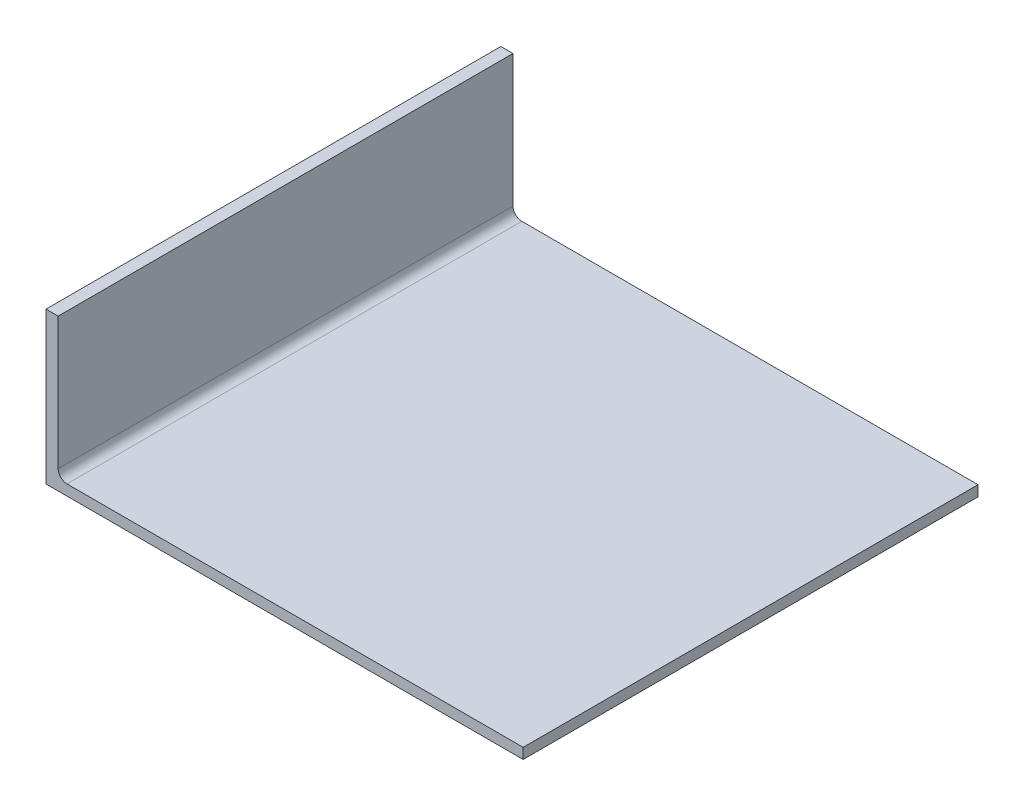
ISO-10303-21;
HEADER;
FILE_DESCRIPTION(('STEP AP214'),'2;1');
FILE_NAME('part.step','',(''),(''),'','','');
FILE_SCHEMA(('AUTOMOTIVE_DESIGN { 1 0 10303 214 1 1 1 1 }'));
ENDSEC;
DATA;
#1=APPLICATION_CONTEXT('core data for automotive mechanical design processes');
#2=APPLICATION_PROTOCOL_DEFINITION('international standard','automotive_design',2000,#1);
#3=PRODUCT_CONTEXT('',#1,'mechanical');
#4=PRODUCT('Part','Part','',(#3));
#5=PRODUCT_RELATED_PRODUCT_CATEGORY('part','',(#4));
#6=PRODUCT_DEFINITION_FORMATION('','',#4);
#7=PRODUCT_DEFINITION_CONTEXT('part definition',#1,'design');
#8=PRODUCT_DEFINITION('design','',#6,#7);
#9=PRODUCT_DEFINITION_SHAPE('','',#8);
#10=(LENGTH_UNIT() NAMED_UNIT(*) SI_UNIT(.MILLI.,.METRE.));
#11=(NAMED_UNIT(*) PLANE_ANGLE_UNIT() SI_UNIT($,.RADIAN.));
#12=(NAMED_UNIT(*) SI_UNIT($,.STERADIAN.) SOLID_ANGLE_UNIT());
#13=UNCERTAINTY_MEASURE_WITH_UNIT(LENGTH_MEASURE(1.E-05),#10,'distance_accuracy_value','');
#14=(GEOMETRIC_REPRESENTATION_CONTEXT(3) GLOBAL_UNCERTAINTY_ASSIGNED_CONTEXT((#13)) GLOBAL_UNIT_ASSIGNED_CONTEXT((#10,
#11,#12)) REPRESENTATION_CONTEXT('',''));
#15=CARTESIAN_POINT('',(0.,0.,0.));
#16=DIRECTION('',(0.,0.,1.));
#17=DIRECTION('',(1.,0.,0.));
#18=AXIS2_PLACEMENT_3D('',#15,#16,#17);
#19=CARTESIAN_POINT('',(-250.24028816854,11.,-21.2242669249853));
#20=DIRECTION('',(0.,0.,1.));
#21=DIRECTION('',(1.,0.,0.));
#22=AXIS2_PLACEMENT_3D('',#19,#20,#21);
#23=CYLINDRICAL_SURFACE('',#22,5.);
#24=DIRECTION('',(0.,0.,-1.));
#25=VECTOR('',#24,1.);
#26=CARTESIAN_POINT('',(-255.24028816854,11.,-21.2242669249853));
#27=LINE('',#26,#25);
#28=CARTESIAN_POINT('',(-255.24028816854,11.,236.996907771633));
#29=VERTEX_POINT('',#28);
#30=CARTESIAN_POINT('',(-255.24028816854,11.,-21.2242669249853));
#31=VERTEX_POINT('',#30);
#32=EDGE_CURVE('E143',#29,#31,#27,.T.);
#33=ORIENTED_EDGE('',*,*,#32,.F.);
#34=CARTESIAN_POINT('',(-250.24028816854,11.,236.996907771633));
#35=DIRECTION('',(0.,0.,-1.));
#36=DIRECTION('',(-1.,0.,0.));
#37=AXIS2_PLACEMENT_3D('',#34,#35,#36);
#38=CIRCLE('',#37,5.);
#39=CARTESIAN_POINT('',(-250.24028816854,6.,236.996907771633));
#40=VERTEX_POINT('',#39);
#41=EDGE_CURVE('E40',#29,#40,#38,.F.);
#42=ORIENTED_EDGE('',*,*,#41,.T.);
#43=DIRECTION('',(0.,0.,-1.));
#44=VECTOR('',#43,1.);
#45=CARTESIAN_POINT('',(-250.24028816854,6.,-21.2242669249853));
#46=LINE('',#45,#44);
#47=CARTESIAN_POINT('',(-250.24028816854,6.,-21.2242669249853));
#48=VERTEX_POINT('',#47);
#49=EDGE_CURVE('E146',#48,#40,#46,.F.);
#50=ORIENTED_EDGE('',*,*,#49,.F.);
#51=CARTESIAN_POINT('',(-250.24028816854,11.,-21.2242669249853));
#52=DIRECTION('',(0.,0.,1.));
#53=DIRECTION('',(1.,0.,0.));
#54=AXIS2_PLACEMENT_3D('',#51,#52,#53);
#55=CIRCLE('',#54,5.);
#56=EDGE_CURVE('E11',#48,#31,#55,.F.);
#57=ORIENTED_EDGE('',*,*,#56,.T.);
#58=EDGE_LOOP('',(#33,#42,#50,#57));
#59=FACE_BOUND('',#58,.T.);
#60=ADVANCED_FACE('F33',(#59),#23,.F.);
#61=CARTESIAN_POINT('',(0.,6.,0.));
#62=DIRECTION('',(0.,-1.,0.));
#63=DIRECTION('',(0.,0.,-1.));
#64=AXIS2_PLACEMENT_3D('',#61,#62,#63);
#65=PLANE('',#64);
#66=DIRECTION('',(-1.,0.,0.));
#67=VECTOR('',#66,1.);
#68=CARTESIAN_POINT('',(8.75531028896149,6.,-21.2242669249854));
#69=LINE('',#68,#67);
#70=CARTESIAN_POINT('',(8.75531028896149,6.,-21.2242669249854));
#71=VERTEX_POINT('',#70);
#72=EDGE_CURVE('E125',#71,#48,#69,.T.);
#73=ORIENTED_EDGE('',*,*,#72,.T.);
#74=ORIENTED_EDGE('',*,*,#49,.T.);
#75=DIRECTION('',(1.,0.,0.));
#76=VECTOR('',#75,1.);
#77=CARTESIAN_POINT('',(8.75531028896152,6.,236.996907771633));
#78=LINE('',#77,#76);
#79=CARTESIAN_POINT('',(8.75531028896152,6.,236.996907771633));
#80=VERTEX_POINT('',#79);
#81=EDGE_CURVE('E129',#40,#80,#78,.T.);
#82=ORIENTED_EDGE('',*,*,#81,.T.);
#83=DIRECTION('',(0.,0.,-1.));
#84=VECTOR('',#83,1.);
#85=CARTESIAN_POINT('',(8.75531028896149,6.,-21.2242669249854));
#86=LINE('',#85,#84);
#87=EDGE_CURVE('E122',#80,#71,#86,.T.);
#88=ORIENTED_EDGE('',*,*,#87,.T.);
#89=EDGE_LOOP('',(#73,#74,#82,#88));
#90=FACE_BOUND('',#89,.T.);
#91=ADVANCED_FACE('F149',(#90),#65,.F.);
#92=CARTESIAN_POINT('',(8.75531028896149,6.,-21.2242669249854));
#93=DIRECTION('',(-1.,0.,0.));
#94=DIRECTION('',(0.,0.,1.));
#95=AXIS2_PLACEMENT_3D('',#92,#93,#94);
#96=PLANE('',#95);
#97=DIRECTION('',(0.,0.,-1.));
#98=VECTOR('',#97,1.);
#99=CARTESIAN_POINT('',(8.75531028896149,0.,-21.2242669249854));
#100=LINE('',#99,#98);
#101=CARTESIAN_POINT('',(8.75531028896152,0.,236.996907771633));
#102=VERTEX_POINT('',#101);
#103=CARTESIAN_POINT('',(8.75531028896149,0.,-21.2242669249854));
#104=VERTEX_POINT('',#103);
#105=EDGE_CURVE('E121',#102,#104,#100,.T.);
#106=ORIENTED_EDGE('',*,*,#105,.T.);
#107=DIRECTION('',(0.,-1.,0.));
#108=VECTOR('',#107,1.);
#109=CARTESIAN_POINT('',(8.75531028896149,6.,-21.2242669249854));
#110=LINE('',#109,#108);
#111=EDGE_CURVE('E140',#71,#104,#110,.T.);
#112=ORIENTED_EDGE('',*,*,#111,.F.);
#113=ORIENTED_EDGE('',*,*,#87,.F.);
#114=DIRECTION('',(0.,-1.,0.));
#115=VECTOR('',#114,1.);
#116=CARTESIAN_POINT('',(8.75531028896152,6.,236.996907771633));
#117=LINE('',#116,#115);
#118=EDGE_CURVE('E99',#80,#102,#117,.T.);
#119=ORIENTED_EDGE('',*,*,#118,.T.);
#120=EDGE_LOOP('',(#106,#112,#113,#119));
#121=FACE_BOUND('',#120,.T.);
#122=ADVANCED_FACE('F155',(#121),#96,.F.);
#123=CARTESIAN_POINT('',(8.75531028896149,6.,-21.2242669249854));
#124=DIRECTION('',(0.,0.,1.));
#125=DIRECTION('',(1.,0.,0.));
#126=AXIS2_PLACEMENT_3D('',#123,#124,#125);
#127=PLANE('',#126);
#128=DIRECTION('',(-1.,0.,0.));
#129=VECTOR('',#128,1.);
#130=CARTESIAN_POINT('',(8.75531028896149,0.,-21.2242669249854));
#131=LINE('',#130,#129);
#132=CARTESIAN_POINT('',(-262.132502922839,0.,-21.2242669249853));
#133=VERTEX_POINT('',#132);
#134=EDGE_CURVE('E133',#104,#133,#131,.T.);
#135=ORIENTED_EDGE('',*,*,#134,.T.);
#136=DIRECTION('',(0.,-1.,0.));
#137=VECTOR('',#136,1.);
#138=CARTESIAN_POINT('',(-262.132502922839,6.,-21.2242669249853));
#139=LINE('',#138,#137);
#140=CARTESIAN_POINT('',(-262.132502922839,86.,-21.2242669249853));
#141=VERTEX_POINT('',#140);
#142=EDGE_CURVE('E98',#141,#133,#139,.T.);
#143=ORIENTED_EDGE('',*,*,#142,.F.);
#144=DIRECTION('',(-1.,0.,0.));
#145=VECTOR('',#144,1.);
#146=CARTESIAN_POINT('',(-262.132502922839,86.,-21.2242669249853));
#147=LINE('',#146,#145);
#148=CARTESIAN_POINT('',(-255.24028816854,86.,-21.2242669249853));
#149=VERTEX_POINT('',#148);
#150=EDGE_CURVE('E113',#149,#141,#147,.T.);
#151=ORIENTED_EDGE('',*,*,#150,.F.);
#152=DIRECTION('',(0.,-1.,0.));
#153=VECTOR('',#152,1.);
#154=CARTESIAN_POINT('',(-255.24028816854,86.,-21.2242669249853));
#155=LINE('',#154,#153);
#156=EDGE_CURVE('E118',#149,#31,#155,.T.);
#157=ORIENTED_EDGE('',*,*,#156,.T.);
#158=ORIENTED_EDGE('',*,*,#56,.F.);
#159=ORIENTED_EDGE('',*,*,#72,.F.);
#160=ORIENTED_EDGE('',*,*,#111,.T.);
#161=EDGE_LOOP('',(#135,#143,#151,#157,#158,#159,#160));
#162=FACE_BOUND('',#161,.T.);
#163=ADVANCED_FACE('F156',(#162),#127,.F.);
#164=CARTESIAN_POINT('',(-262.132502922839,6.,-21.2242669249853));
#165=DIRECTION('',(1.,0.,0.));
#166=DIRECTION('',(0.,0.,-1.));
#167=AXIS2_PLACEMENT_3D('',#164,#165,#166);
#168=PLANE('',#167);
#169=DIRECTION('',(0.,0.,1.));
#170=VECTOR('',#169,1.);
#171=CARTESIAN_POINT('',(-262.132502922839,0.,-21.2242669249853));
#172=LINE('',#171,#170);
#173=CARTESIAN_POINT('',(-262.132502922839,0.,236.996907771633));
#174=VERTEX_POINT('',#173);
#175=EDGE_CURVE('E95',#133,#174,#172,.T.);
#176=ORIENTED_EDGE('',*,*,#175,.T.);
#177=DIRECTION('',(0.,-1.,0.));
#178=VECTOR('',#177,1.);
#179=CARTESIAN_POINT('',(-262.132502922839,6.,236.996907771633));
#180=LINE('',#179,#178);
#181=CARTESIAN_POINT('',(-262.132502922839,86.,236.996907771633));
#182=VERTEX_POINT('',#181);
#183=EDGE_CURVE('E88',#182,#174,#180,.T.);
#184=ORIENTED_EDGE('',*,*,#183,.F.);
#185=DIRECTION('',(0.,0.,1.));
#186=VECTOR('',#185,1.);
#187=CARTESIAN_POINT('',(-262.132502922839,86.,-21.2242669249853));
#188=LINE('',#187,#186);
#189=EDGE_CURVE('E93',#141,#182,#188,.T.);
#190=ORIENTED_EDGE('',*,*,#189,.F.);
#191=ORIENTED_EDGE('',*,*,#142,.T.);
#192=EDGE_LOOP('',(#176,#184,#190,#191));
#193=FACE_BOUND('',#192,.T.);
#194=ADVANCED_FACE('F90',(#193),#168,.F.);
#195=CARTESIAN_POINT('',(8.75531028896152,6.,236.996907771633));
#196=DIRECTION('',(0.,0.,-1.));
#197=DIRECTION('',(-1.,0.,0.));
#198=AXIS2_PLACEMENT_3D('',#195,#196,#197);
#199=PLANE('',#198);
#200=DIRECTION('',(1.,0.,0.));
#201=VECTOR('',#200,1.);
#202=CARTESIAN_POINT('',(8.75531028896152,0.,236.996907771633));
#203=LINE('',#202,#201);
#204=EDGE_CURVE('E126',#174,#102,#203,.T.);
#205=ORIENTED_EDGE('',*,*,#204,.T.);
#206=ORIENTED_EDGE('',*,*,#118,.F.);
#207=ORIENTED_EDGE('',*,*,#81,.F.);
#208=ORIENTED_EDGE('',*,*,#41,.F.);
#209=DIRECTION('',(0.,-1.,0.));
#210=VECTOR('',#209,1.);
#211=CARTESIAN_POINT('',(-255.24028816854,86.,236.996907771633));
#212=LINE('',#211,#210);
#213=CARTESIAN_POINT('',(-255.24028816854,86.,236.996907771633));
#214=VERTEX_POINT('',#213);
#215=EDGE_CURVE('E105',#214,#29,#212,.T.);
#216=ORIENTED_EDGE('',*,*,#215,.F.);
#217=DIRECTION('',(1.,0.,0.));
#218=VECTOR('',#217,1.);
#219=CARTESIAN_POINT('',(-262.132502922839,86.,236.996907771633));
#220=LINE('',#219,#218);
#221=EDGE_CURVE('E102',#182,#214,#220,.T.);
#222=ORIENTED_EDGE('',*,*,#221,.F.);
#223=ORIENTED_EDGE('',*,*,#183,.T.);
#224=EDGE_LOOP('',(#205,#206,#207,#208,#216,#222,#223));
#225=FACE_BOUND('',#224,.T.);
#226=ADVANCED_FACE('F103',(#225),#199,.F.);
#227=CARTESIAN_POINT('',(0.,0.,0.));
#228=DIRECTION('',(0.,-1.,0.));
#229=DIRECTION('',(0.,0.,-1.));
#230=AXIS2_PLACEMENT_3D('',#227,#228,#229);
#231=PLANE('',#230);
#232=ORIENTED_EDGE('',*,*,#105,.F.);
#233=ORIENTED_EDGE('',*,*,#204,.F.);
#234=ORIENTED_EDGE('',*,*,#175,.F.);
#235=ORIENTED_EDGE('',*,*,#134,.F.);
#236=EDGE_LOOP('',(#232,#233,#234,#235));
#237=FACE_BOUND('',#236,.T.);
#238=ADVANCED_FACE('F158',(#237),#231,.T.);
#239=CARTESIAN_POINT('',(-255.24028816854,86.,-21.2242669249853));
#240=DIRECTION('',(-1.,0.,0.));
#241=DIRECTION('',(0.,0.,1.));
#242=AXIS2_PLACEMENT_3D('',#239,#240,#241);
#243=PLANE('',#242);
#244=ORIENTED_EDGE('',*,*,#215,.T.);
#245=ORIENTED_EDGE('',*,*,#32,.T.);
#246=ORIENTED_EDGE('',*,*,#156,.F.);
#247=DIRECTION('',(0.,0.,-1.));
#248=VECTOR('',#247,1.);
#249=CARTESIAN_POINT('',(-255.24028816854,86.,-21.2242669249853));
#250=LINE('',#249,#248);
#251=EDGE_CURVE('E108',#214,#149,#250,.T.);
#252=ORIENTED_EDGE('',*,*,#251,.F.);
#253=EDGE_LOOP('',(#244,#245,#246,#252));
#254=FACE_BOUND('',#253,.T.);
#255=ADVANCED_FACE('F160',(#254),#243,.F.);
#256=CARTESIAN_POINT('',(0.,86.,0.));
#257=DIRECTION('',(0.,1.,0.));
#258=DIRECTION('',(0.,0.,1.));
#259=AXIS2_PLACEMENT_3D('',#256,#257,#258);
#260=PLANE('',#259);
#261=ORIENTED_EDGE('',*,*,#189,.T.);
#262=ORIENTED_EDGE('',*,*,#221,.T.);
#263=ORIENTED_EDGE('',*,*,#251,.T.);
#264=ORIENTED_EDGE('',*,*,#150,.T.);
#265=EDGE_LOOP('',(#261,#262,#263,#264));
#266=FACE_BOUND('',#265,.T.);
#267=ADVANCED_FACE('F111',(#266),#260,.T.);
#268=CLOSED_SHELL('',(#60,#91,#122,#163,#194,#226,#238,#255,#267));
#269=MANIFOLD_SOLID_BREP('B2',#268);
#270=ADVANCED_BREP_SHAPE_REPRESENTATION('',(#18,#269),#14);
#271=SHAPE_DEFINITION_REPRESENTATION(#9,#270);
ENDSEC;
END-ISO-10303-21;
